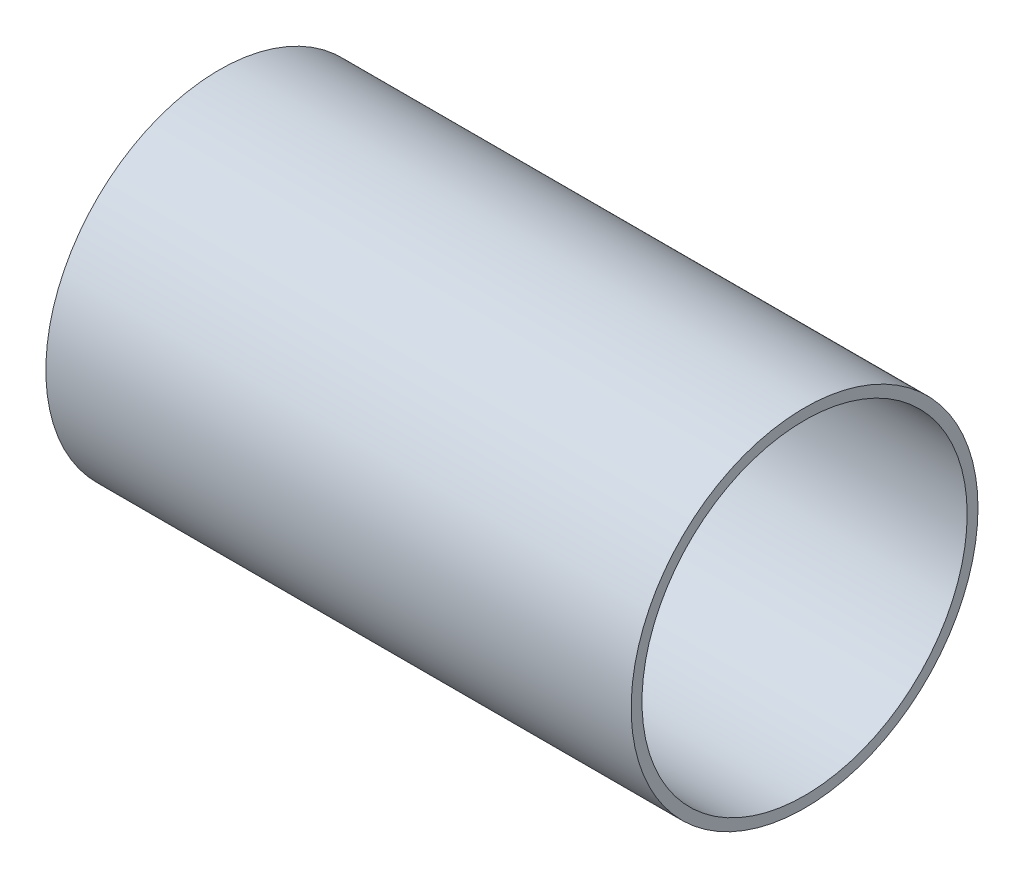
ISO-10303-21;
HEADER;
FILE_DESCRIPTION(('STEP AP214'),'2;1');
FILE_NAME('part.step','',(''),(''),'','','');
FILE_SCHEMA(('AUTOMOTIVE_DESIGN { 1 0 10303 214 1 1 1 1 }'));
ENDSEC;
DATA;
#1=APPLICATION_CONTEXT('core data for automotive mechanical design processes');
#2=APPLICATION_PROTOCOL_DEFINITION('international standard','automotive_design',2000,#1);
#3=PRODUCT_CONTEXT('',#1,'mechanical');
#4=PRODUCT('Part','Part','',(#3));
#5=PRODUCT_RELATED_PRODUCT_CATEGORY('part','',(#4));
#6=PRODUCT_DEFINITION_FORMATION('','',#4);
#7=PRODUCT_DEFINITION_CONTEXT('part definition',#1,'design');
#8=PRODUCT_DEFINITION('design','',#6,#7);
#9=PRODUCT_DEFINITION_SHAPE('','',#8);
#10=(LENGTH_UNIT() NAMED_UNIT(*) SI_UNIT(.MILLI.,.METRE.));
#11=(NAMED_UNIT(*) PLANE_ANGLE_UNIT() SI_UNIT($,.RADIAN.));
#12=(NAMED_UNIT(*) SI_UNIT($,.STERADIAN.) SOLID_ANGLE_UNIT());
#13=UNCERTAINTY_MEASURE_WITH_UNIT(LENGTH_MEASURE(1.E-05),#10,'distance_accuracy_value','');
#14=(GEOMETRIC_REPRESENTATION_CONTEXT(3) GLOBAL_UNCERTAINTY_ASSIGNED_CONTEXT((#13)) GLOBAL_UNIT_ASSIGNED_CONTEXT((#10,
#11,#12)) REPRESENTATION_CONTEXT('',''));
#15=CARTESIAN_POINT('',(0.,0.,0.));
#16=DIRECTION('',(0.,0.,1.));
#17=DIRECTION('',(1.,0.,0.));
#18=AXIS2_PLACEMENT_3D('',#15,#16,#17);
#19=CARTESIAN_POINT('',(34.29,0.,0.));
#20=DIRECTION('',(1.,0.,0.));
#21=DIRECTION('',(0.,0.,-1.));
#22=AXIS2_PLACEMENT_3D('',#19,#20,#21);
#23=PLANE('',#22);
#24=CARTESIAN_POINT('',(34.29,0.,0.));
#25=DIRECTION('',(1.,0.,0.));
#26=DIRECTION('',(0.,0.,-1.));
#27=AXIS2_PLACEMENT_3D('',#24,#25,#26);
#28=CIRCLE('',#27,10.16);
#29=CARTESIAN_POINT('',(34.29,0.,-10.16));
#30=VERTEX_POINT('',#29);
#31=EDGE_CURVE('E10',#30,#30,#28,.T.);
#32=ORIENTED_EDGE('',*,*,#31,.T.);
#33=EDGE_LOOP('',(#32));
#34=FACE_BOUND('',#33,.T.);
#35=CARTESIAN_POINT('',(34.29,0.,0.));
#36=DIRECTION('',(1.,0.,0.));
#37=DIRECTION('',(0.,0.,-1.));
#38=AXIS2_PLACEMENT_3D('',#35,#36,#37);
#39=CIRCLE('',#38,9.525);
#40=CARTESIAN_POINT('',(34.29,0.,-9.525));
#41=VERTEX_POINT('',#40);
#42=EDGE_CURVE('E47',#41,#41,#39,.T.);
#43=ORIENTED_EDGE('',*,*,#42,.F.);
#44=EDGE_LOOP('',(#43));
#45=FACE_BOUND('',#44,.T.);
#46=ADVANCED_FACE('F36',(#34,#45),#23,.T.);
#47=CARTESIAN_POINT('',(0.,0.,0.));
#48=DIRECTION('',(1.,0.,0.));
#49=DIRECTION('',(0.,0.,-1.));
#50=AXIS2_PLACEMENT_3D('',#47,#48,#49);
#51=PLANE('',#50);
#52=CARTESIAN_POINT('',(0.,0.,0.));
#53=DIRECTION('',(1.,0.,0.));
#54=DIRECTION('',(0.,0.,-1.));
#55=AXIS2_PLACEMENT_3D('',#52,#53,#54);
#56=CIRCLE('',#55,10.16);
#57=CARTESIAN_POINT('',(0.,0.,-10.16));
#58=VERTEX_POINT('',#57);
#59=EDGE_CURVE('E40',#58,#58,#56,.T.);
#60=ORIENTED_EDGE('',*,*,#59,.F.);
#61=EDGE_LOOP('',(#60));
#62=FACE_BOUND('',#61,.T.);
#63=CARTESIAN_POINT('',(0.,0.,0.));
#64=DIRECTION('',(1.,0.,0.));
#65=DIRECTION('',(0.,0.,-1.));
#66=AXIS2_PLACEMENT_3D('',#63,#64,#65);
#67=CIRCLE('',#66,9.525);
#68=CARTESIAN_POINT('',(0.,0.,-9.525));
#69=VERTEX_POINT('',#68);
#70=EDGE_CURVE('E49',#69,#69,#67,.T.);
#71=ORIENTED_EDGE('',*,*,#70,.T.);
#72=EDGE_LOOP('',(#71));
#73=FACE_BOUND('',#72,.T.);
#74=ADVANCED_FACE('F59',(#62,#73),#51,.F.);
#75=CARTESIAN_POINT('',(34.29,0.,0.));
#76=DIRECTION('',(-1.,0.,0.));
#77=DIRECTION('',(0.,0.,1.));
#78=AXIS2_PLACEMENT_3D('',#75,#76,#77);
#79=CYLINDRICAL_SURFACE('',#78,10.16);
#80=ORIENTED_EDGE('',*,*,#31,.F.);
#81=EDGE_LOOP('',(#80));
#82=FACE_BOUND('',#81,.T.);
#83=ORIENTED_EDGE('',*,*,#59,.T.);
#84=EDGE_LOOP('',(#83));
#85=FACE_BOUND('',#84,.T.);
#86=ADVANCED_FACE('F38',(#82,#85),#79,.T.);
#87=CARTESIAN_POINT('',(34.29,0.,0.));
#88=DIRECTION('',(-1.,0.,0.));
#89=DIRECTION('',(0.,0.,1.));
#90=AXIS2_PLACEMENT_3D('',#87,#88,#89);
#91=CYLINDRICAL_SURFACE('',#90,9.525);
#92=ORIENTED_EDGE('',*,*,#42,.T.);
#93=EDGE_LOOP('',(#92));
#94=FACE_BOUND('',#93,.T.);
#95=ORIENTED_EDGE('',*,*,#70,.F.);
#96=EDGE_LOOP('',(#95));
#97=FACE_BOUND('',#96,.T.);
#98=ADVANCED_FACE('F55',(#94,#97),#91,.F.);
#99=CLOSED_SHELL('',(#46,#74,#86,#98));
#100=MANIFOLD_SOLID_BREP('B2',#99);
#101=ADVANCED_BREP_SHAPE_REPRESENTATION('',(#18,#100),#14);
#102=SHAPE_DEFINITION_REPRESENTATION(#9,#101);
ENDSEC;
END-ISO-10303-21;
